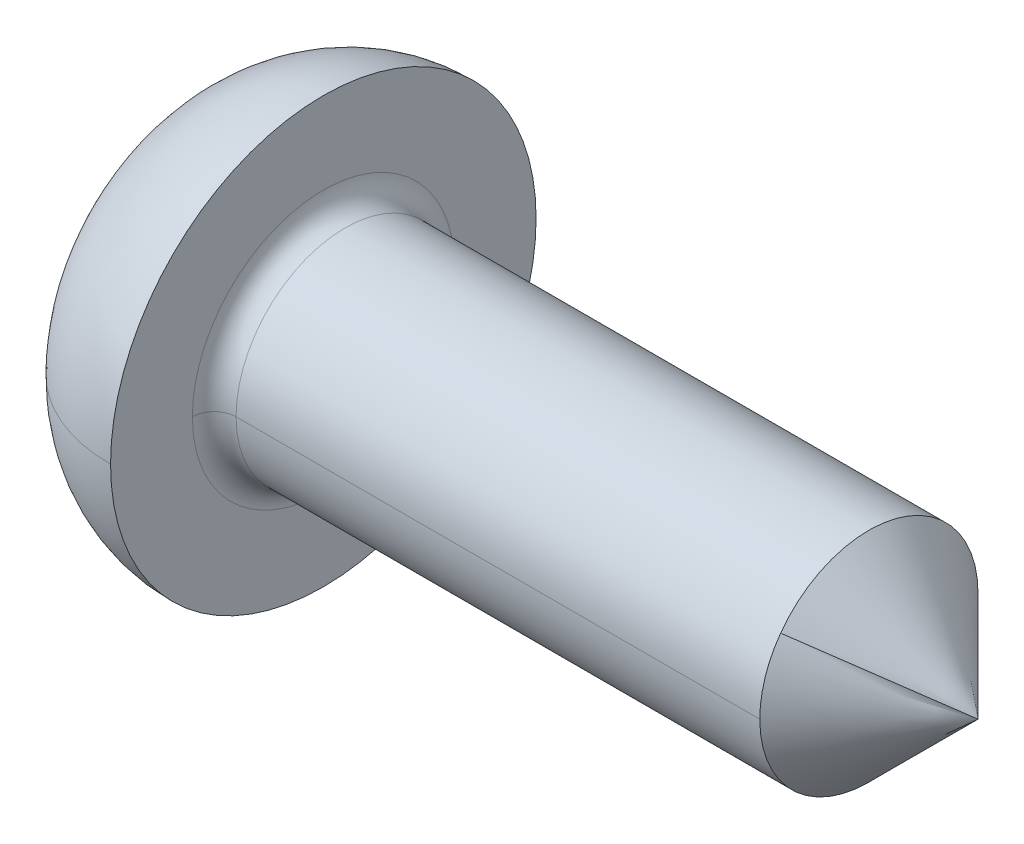
ISO-10303-21;
HEADER;
FILE_DESCRIPTION(('STEP AP214'),'2;1');
FILE_NAME('part.step','',(''),(''),'','','');
FILE_SCHEMA(('AUTOMOTIVE_DESIGN { 1 0 10303 214 1 1 1 1 }'));
ENDSEC;
DATA;
#1=APPLICATION_CONTEXT('core data for automotive mechanical design processes');
#2=APPLICATION_PROTOCOL_DEFINITION('international standard','automotive_design',2000,#1);
#3=PRODUCT_CONTEXT('',#1,'mechanical');
#4=PRODUCT('Part','Part','',(#3));
#5=PRODUCT_RELATED_PRODUCT_CATEGORY('part','',(#4));
#6=PRODUCT_DEFINITION_FORMATION('','',#4);
#7=PRODUCT_DEFINITION_CONTEXT('part definition',#1,'design');
#8=PRODUCT_DEFINITION('design','',#6,#7);
#9=PRODUCT_DEFINITION_SHAPE('','',#8);
#10=(LENGTH_UNIT() NAMED_UNIT(*) SI_UNIT(.MILLI.,.METRE.));
#11=(NAMED_UNIT(*) PLANE_ANGLE_UNIT() SI_UNIT($,.RADIAN.));
#12=(NAMED_UNIT(*) SI_UNIT($,.STERADIAN.) SOLID_ANGLE_UNIT());
#13=UNCERTAINTY_MEASURE_WITH_UNIT(LENGTH_MEASURE(1.E-05),#10,'distance_accuracy_value','');
#14=(GEOMETRIC_REPRESENTATION_CONTEXT(3) GLOBAL_UNCERTAINTY_ASSIGNED_CONTEXT((#13)) GLOBAL_UNIT_ASSIGNED_CONTEXT((#10,
#11,#12)) REPRESENTATION_CONTEXT('',''));
#15=CARTESIAN_POINT('',(0.,0.,0.));
#16=DIRECTION('',(0.,0.,1.));
#17=DIRECTION('',(1.,0.,0.));
#18=AXIS2_PLACEMENT_3D('',#15,#16,#17);
#19=CARTESIAN_POINT('',(7.6,0.,0.));
#20=DIRECTION('',(-1.,0.,0.));
#21=DIRECTION('',(0.,0.,1.));
#22=AXIS2_PLACEMENT_3D('',#19,#20,#21);
#23=CONICAL_SURFACE('',#22,0.,0.785398163397449);
#24=DIRECTION('',(-0.707106781186546,0.415626937777454,0.572061402817686));
#25=VECTOR('',#24,1.);
#26=CARTESIAN_POINT('',(7.1,0.293892626146238,0.404508497187476));
#27=LINE('',#26,#25);
#28=CARTESIAN_POINT('',(7.6,0.,0.));
#29=VERTEX_POINT('',#28);
#30=CARTESIAN_POINT('',(6.6,0.587785252292476,0.809016994374952));
#31=VERTEX_POINT('',#30);
#32=EDGE_CURVE('E151',#29,#31,#27,.T.);
#33=ORIENTED_EDGE('',*,*,#32,.F.);
#34=DIRECTION('',(-0.707106781186542,-0.415626937777458,-0.572061402817687));
#35=VECTOR('',#34,1.);
#36=CARTESIAN_POINT('',(7.1,-0.293892626146242,-0.404508497187479));
#37=LINE('',#36,#35);
#38=CARTESIAN_POINT('',(6.6,-0.587785252292484,-0.809016994374958));
#39=VERTEX_POINT('',#38);
#40=EDGE_CURVE('E20',#29,#39,#37,.T.);
#41=ORIENTED_EDGE('',*,*,#40,.T.);
#42=CARTESIAN_POINT('',(6.59999999999993,0.,0.));
#43=DIRECTION('',(1.,0.,0.));
#44=DIRECTION('',(0.,-0.587785252292462,-0.809016994374955));
#45=AXIS2_PLACEMENT_3D('',#42,#43,#44);
#46=CIRCLE('',#45,0.999999999999987);
#47=CARTESIAN_POINT('',(6.6,0.,-1.));
#48=VERTEX_POINT('',#47);
#49=EDGE_CURVE('E27',#39,#48,#46,.T.);
#50=ORIENTED_EDGE('',*,*,#49,.T.);
#51=CARTESIAN_POINT('',(6.59999999999999,0.,0.));
#52=DIRECTION('',(1.,0.,0.));
#53=DIRECTION('',(0.,0.,-1.));
#54=AXIS2_PLACEMENT_3D('',#51,#52,#53);
#55=CIRCLE('',#54,0.999999999999988);
#56=EDGE_CURVE('E192',#48,#31,#55,.T.);
#57=ORIENTED_EDGE('',*,*,#56,.T.);
#58=EDGE_LOOP('',(#33,#41,#50,#57));
#59=FACE_BOUND('',#58,.T.);
#60=ADVANCED_FACE('F16',(#59),#23,.T.);
#61=CARTESIAN_POINT('',(1.8,0.,0.));
#62=DIRECTION('',(-1.,0.,0.));
#63=DIRECTION('',(0.,0.,1.));
#64=AXIS2_PLACEMENT_3D('',#61,#62,#63);
#65=TOROIDAL_SURFACE('',#64,1.2,0.199999999999999);
#66=CARTESIAN_POINT('',(1.8,0.,1.2));
#67=DIRECTION('',(0.,-1.,0.));
#68=DIRECTION('',(-1.,0.,0.));
#69=AXIS2_PLACEMENT_3D('',#66,#67,#68);
#70=CIRCLE('',#69,0.199999999999998);
#71=CARTESIAN_POINT('',(1.6,0.,1.2));
#72=VERTEX_POINT('',#71);
#73=CARTESIAN_POINT('',(1.8,0.,1.));
#74=VERTEX_POINT('',#73);
#75=EDGE_CURVE('E212',#72,#74,#70,.T.);
#76=ORIENTED_EDGE('',*,*,#75,.F.);
#77=CARTESIAN_POINT('',(1.6,0.,0.));
#78=DIRECTION('',(-1.,0.,0.));
#79=DIRECTION('',(0.,0.,-1.));
#80=AXIS2_PLACEMENT_3D('',#77,#78,#79);
#81=CIRCLE('',#80,1.2);
#82=CARTESIAN_POINT('',(1.6,0.,-1.2));
#83=VERTEX_POINT('',#82);
#84=EDGE_CURVE('E349',#83,#72,#81,.T.);
#85=ORIENTED_EDGE('',*,*,#84,.F.);
#86=CARTESIAN_POINT('',(1.8,0.,-1.2));
#87=DIRECTION('',(0.,1.,0.));
#88=DIRECTION('',(-1.,0.,0.));
#89=AXIS2_PLACEMENT_3D('',#86,#87,#88);
#90=CIRCLE('',#89,0.199999999999999);
#91=CARTESIAN_POINT('',(1.8,0.,-1.));
#92=VERTEX_POINT('',#91);
#93=EDGE_CURVE('E217',#83,#92,#90,.T.);
#94=ORIENTED_EDGE('',*,*,#93,.T.);
#95=CARTESIAN_POINT('',(1.8,0.,0.));
#96=DIRECTION('',(1.,0.,0.));
#97=DIRECTION('',(0.,0.,1.));
#98=AXIS2_PLACEMENT_3D('',#95,#96,#97);
#99=CIRCLE('',#98,1.);
#100=EDGE_CURVE('E352',#74,#92,#99,.T.);
#101=ORIENTED_EDGE('',*,*,#100,.F.);
#102=EDGE_LOOP('',(#76,#85,#94,#101));
#103=FACE_BOUND('',#102,.T.);
#104=ADVANCED_FACE('F361',(#103),#65,.F.);
#105=CARTESIAN_POINT('',(1.58765170566236,0.,0.));
#106=DIRECTION('',(-1.,0.,0.));
#107=DIRECTION('',(0.,0.,1.));
#108=AXIS2_PLACEMENT_3D('',#105,#106,#107);
#109=DEGENERATE_TOROIDAL_SURFACE('',#108,0.55005445811189,1.39999999999999,.T.);
#110=CARTESIAN_POINT('',(1.58765170609632,0.,0.550054456325777));
#111=DIRECTION('',(0.,1.,0.));
#112=DIRECTION('',(-0.791498104640753,0.,0.611171621028084));
#113=AXIS2_PLACEMENT_3D('',#110,#111,#112);
#114=CIRCLE('',#113,1.40000000200565);
#115=CARTESIAN_POINT('',(0.479554358,0.,1.405694727));
#116=VERTEX_POINT('',#115);
#117=CARTESIAN_POINT('',(1.6,0.,1.95));
#118=VERTEX_POINT('',#117);
#119=EDGE_CURVE('E225',#116,#118,#114,.T.);
#120=ORIENTED_EDGE('',*,*,#119,.F.);
#121=CARTESIAN_POINT('',(0.479554358146888,1.67089866280471E-10,-2.20725731945309E-10));
#122=DIRECTION('',(-1.,-1.18868054404933E-10,-1.04494820901307E-10));
#123=DIRECTION('',(1.18868054384562E-10,-1.,1.57004236163373E-10));
#124=AXIS2_PLACEMENT_3D('',#121,#122,#123);
#125=CIRCLE('',#124,1.40569472721441);
#126=CARTESIAN_POINT('',(0.47955435831398,-1.40569472705363,0.));
#127=VERTEX_POINT('',#126);
#128=EDGE_CURVE('E11',#127,#116,#125,.T.);
#129=ORIENTED_EDGE('',*,*,#128,.F.);
#130=CARTESIAN_POINT('',(0.47955435911592,-1.32477119520608E-09,-1.49185405782376E-09));
#131=DIRECTION('',(-1.,4.77289644101491E-10,4.77288722369394E-10));
#132=DIRECTION('',(-4.77288728404106E-10,9.42433439867832E-10,-1.));
#133=AXIS2_PLACEMENT_3D('',#130,#131,#132);
#134=CIRCLE('',#133,1.40569472513012);
#135=CARTESIAN_POINT('',(0.479554358444998,0.,-1.40569472661835));
#136=VERTEX_POINT('',#135);
#137=EDGE_CURVE('E247',#136,#127,#134,.T.);
#138=ORIENTED_EDGE('',*,*,#137,.F.);
#139=CARTESIAN_POINT('',(1.58765170566237,0.,-0.550054458111893));
#140=DIRECTION('',(0.,-1.,0.));
#141=DIRECTION('',(-0.791498105155269,0.,-0.611171620361759));
#142=AXIS2_PLACEMENT_3D('',#139,#140,#141);
#143=CIRCLE('',#142,1.39999999999999);
#144=CARTESIAN_POINT('',(1.59999999999805,0.,-1.94999999977663));
#145=VERTEX_POINT('',#144);
#146=EDGE_CURVE('E233',#136,#145,#143,.T.);
#147=ORIENTED_EDGE('',*,*,#146,.T.);
#148=CARTESIAN_POINT('',(1.59999999999805,-2.23371437941031E-10,0.));
#149=DIRECTION('',(-1.,-9.99245202251857E-13,0.));
#150=DIRECTION('',(0.,1.14549691706295E-10,-1.));
#151=AXIS2_PLACEMENT_3D('',#148,#149,#150);
#152=CIRCLE('',#151,1.94999999978302);
#153=EDGE_CURVE('E346',#145,#118,#152,.T.);
#154=ORIENTED_EDGE('',*,*,#153,.T.);
#155=EDGE_LOOP('',(#120,#129,#138,#147,#154));
#156=FACE_BOUND('',#155,.T.);
#157=ADVANCED_FACE('F379',(#156),#109,.T.);
#158=CARTESIAN_POINT('',(2.30000000000002,0.,0.));
#159=DIRECTION('',(-1.,0.,0.));
#160=DIRECTION('',(0.,-1.,0.));
#161=AXIS2_PLACEMENT_3D('',#158,#159,#160);
#162=SPHERICAL_SURFACE('',#161,2.30000000000002);
#163=CARTESIAN_POINT('',(2.29999998636885,1.03593599627347E-08,0.));
#164=DIRECTION('',(0.,0.,-1.));
#165=DIRECTION('',(-0.884928367598718,0.465727156411421,0.));
#166=AXIS2_PLACEMENT_3D('',#163,#164,#165);
#167=CIRCLE('',#166,2.29999998287399);
#168=CARTESIAN_POINT('',(0.264664756052205,1.07117246212689,0.));
#169=VERTEX_POINT('',#168);
#170=CARTESIAN_POINT('',(0.47955435823357,1.4056947269495,0.));
#171=VERTEX_POINT('',#170);
#172=EDGE_CURVE('E244',#169,#171,#167,.T.);
#173=ORIENTED_EDGE('',*,*,#172,.F.);
#174=CARTESIAN_POINT('',(2.15895189968918,-0.208751319488955,-2.87422299905146E-10));
#175=DIRECTION('',(0.559857422063721,0.828588961403762,0.));
#176=DIRECTION('',(-0.828588961403762,0.559857422063721,1.25710158176161E-10));
#177=AXIS2_PLACEMENT_3D('',#174,#175,#176);
#178=CIRCLE('',#177,2.28616024576008);
#179=CARTESIAN_POINT('',(0.27749446,1.062503743,0.265625936));
#180=VERTEX_POINT('',#179);
#181=EDGE_CURVE('E334',#169,#180,#178,.T.);
#182=ORIENTED_EDGE('',*,*,#181,.T.);
#183=CARTESIAN_POINT('',(2.28751608943151,2.10060709603631E-09,-0.0739047401520381));
#184=DIRECTION('',(0.166559361072882,4.70528438530067E-10,0.98603142913347));
#185=DIRECTION('',(-0.874386852948937,0.462203634353054,0.147700479961587));
#186=AXIS2_PLACEMENT_3D('',#183,#184,#185);
#187=CIRCLE('',#186,2.29877842130487);
#188=CARTESIAN_POINT('',(0.040964512,0.305580319,0.305580319));
#189=VERTEX_POINT('',#188);
#190=EDGE_CURVE('E42',#180,#189,#187,.T.);
#191=ORIENTED_EDGE('',*,*,#190,.T.);
#192=CARTESIAN_POINT('',(2.28751608943132,-0.0739047403057367,2.0925546451861E-09));
#193=DIRECTION('',(0.166559361135809,0.98603142912284,4.50303207074824E-10));
#194=DIRECTION('',(-0.977280609816511,0.16508118215501,0.132931610142105));
#195=AXIS2_PLACEMENT_3D('',#192,#193,#194);
#196=CIRCLE('',#195,2.29877842133112);
#197=CARTESIAN_POINT('',(0.27749446,0.265625936,1.062503743));
#198=VERTEX_POINT('',#197);
#199=EDGE_CURVE('E341',#189,#198,#196,.T.);
#200=ORIENTED_EDGE('',*,*,#199,.T.);
#201=CARTESIAN_POINT('',(2.15895188317715,0.,-0.208751269382771));
#202=DIRECTION('',(0.559857410287015,0.,0.828588969360996));
#203=DIRECTION('',(-0.822977068561767,0.116188679823596,0.556065585432447));
#204=AXIS2_PLACEMENT_3D('',#201,#202,#203);
#205=CIRCLE('',#204,2.28616020427492);
#206=CARTESIAN_POINT('',(0.27749446,-0.265625936,1.062503743));
#207=VERTEX_POINT('',#206);
#208=EDGE_CURVE('E290',#198,#207,#205,.T.);
#209=ORIENTED_EDGE('',*,*,#208,.T.);
#210=CARTESIAN_POINT('',(2.28751608938093,0.0739047402972896,2.10874766541809E-09));
#211=DIRECTION('',(0.166559361135836,-0.986031429122836,4.50294748047722E-10));
#212=DIRECTION('',(-0.874386852937027,-0.147700480026478,0.462203634354849));
#213=AXIS2_PLACEMENT_3D('',#210,#211,#212);
#214=CIRCLE('',#213,2.29877842127833);
#215=CARTESIAN_POINT('',(0.040964512,-0.305580319,0.305580319));
#216=VERTEX_POINT('',#215);
#217=EDGE_CURVE('E298',#207,#216,#214,.T.);
#218=ORIENTED_EDGE('',*,*,#217,.T.);
#219=CARTESIAN_POINT('',(2.28751608943135,-2.10065710486151E-09,-0.0739047401520521));
#220=DIRECTION('',(0.166559361072899,-4.70523062321883E-10,0.986031429133467));
#221=DIRECTION('',(-0.977280609827755,-0.132931610140108,0.165081182090052));
#222=AXIS2_PLACEMENT_3D('',#219,#220,#221);
#223=CIRCLE('',#222,2.29877842130471);
#224=CARTESIAN_POINT('',(0.27749446,-1.062503743,0.265625936));
#225=VERTEX_POINT('',#224);
#226=EDGE_CURVE('E306',#216,#225,#223,.T.);
#227=ORIENTED_EDGE('',*,*,#226,.T.);
#228=CARTESIAN_POINT('',(2.15895191462946,0.208751329581617,-3.45604187518419E-09));
#229=DIRECTION('',(0.559857422063085,-0.828588961404192,0.));
#230=DIRECTION('',(-0.822977060806718,-0.556065597228663,0.116188678298128));
#231=AXIS2_PLACEMENT_3D('',#228,#229,#230);
#232=CIRCLE('',#231,2.28616026403591);
#233=CARTESIAN_POINT('',(0.264664755848336,-1.07117246226464,0.));
#234=VERTEX_POINT('',#233);
#235=EDGE_CURVE('E312',#225,#234,#232,.T.);
#236=ORIENTED_EDGE('',*,*,#235,.T.);
#237=CARTESIAN_POINT('',(2.3000000000001,0.,0.));
#238=DIRECTION('',(0.,0.,1.));
#239=DIRECTION('',(-0.88492836702246,-0.465727157506369,0.));
#240=AXIS2_PLACEMENT_3D('',#237,#238,#239);
#241=CIRCLE('',#240,2.30000000000012);
#242=EDGE_CURVE('E251',#234,#127,#241,.T.);
#243=ORIENTED_EDGE('',*,*,#242,.T.);
#244=ORIENTED_EDGE('',*,*,#128,.T.);
#245=CARTESIAN_POINT('',(0.479554358066478,-1.67090083090079E-10,5.04776837227034E-11));
#246=DIRECTION('',(-1.,1.18867977268328E-10,-4.72918544496762E-11));
#247=DIRECTION('',(-4.72918544414832E-11,1.1886655038728E-10,1.));
#248=AXIS2_PLACEMENT_3D('',#245,#246,#247);
#249=CIRCLE('',#248,1.40569472702972);
#250=EDGE_CURVE('E221',#116,#171,#249,.T.);
#251=ORIENTED_EDGE('',*,*,#250,.T.);
#252=EDGE_LOOP('',(#173,#182,#191,#200,#209,#218,#227,#236,#243,#244,#251));
#253=FACE_BOUND('',#252,.T.);
#254=ADVANCED_FACE('F382',(#253),#162,.T.);
#255=CARTESIAN_POINT('',(1.8,0.,0.));
#256=DIRECTION('',(1.,0.,0.));
#257=DIRECTION('',(0.,1.,0.));
#258=AXIS2_PLACEMENT_3D('',#255,#256,#257);
#259=CYLINDRICAL_SURFACE('',#258,1.);
#260=DIRECTION('',(1.,0.,0.));
#261=VECTOR('',#260,1.);
#262=CARTESIAN_POINT('',(4.2,0.,0.999999999999994));
#263=LINE('',#262,#261);
#264=CARTESIAN_POINT('',(6.6,0.,0.999999999999989));
#265=VERTEX_POINT('',#264);
#266=EDGE_CURVE('E182',#74,#265,#263,.T.);
#267=ORIENTED_EDGE('',*,*,#266,.F.);
#268=ORIENTED_EDGE('',*,*,#100,.T.);
#269=DIRECTION('',(1.,0.,0.));
#270=VECTOR('',#269,1.);
#271=CARTESIAN_POINT('',(4.2,0.,-1.));
#272=LINE('',#271,#270);
#273=EDGE_CURVE('E280',#92,#48,#272,.T.);
#274=ORIENTED_EDGE('',*,*,#273,.T.);
#275=ORIENTED_EDGE('',*,*,#49,.F.);
#276=CARTESIAN_POINT('',(6.6,0.,0.));
#277=DIRECTION('',(1.,0.,0.));
#278=DIRECTION('',(0.,0.,1.));
#279=AXIS2_PLACEMENT_3D('',#276,#277,#278);
#280=CIRCLE('',#279,1.);
#281=EDGE_CURVE('E195',#265,#39,#280,.T.);
#282=ORIENTED_EDGE('',*,*,#281,.F.);
#283=EDGE_LOOP('',(#267,#268,#274,#275,#282));
#284=FACE_BOUND('',#283,.T.);
#285=ADVANCED_FACE('F196',(#284),#259,.T.);
#286=CARTESIAN_POINT('',(1.6,-1.96,1.96));
#287=DIRECTION('',(1.,0.,0.));
#288=DIRECTION('',(0.,0.,-1.));
#289=AXIS2_PLACEMENT_3D('',#286,#287,#288);
#290=PLANE('',#289);
#291=CARTESIAN_POINT('',(1.6,0.,0.));
#292=DIRECTION('',(-1.,0.,0.));
#293=DIRECTION('',(0.,0.,1.));
#294=AXIS2_PLACEMENT_3D('',#291,#292,#293);
#295=CIRCLE('',#294,1.2);
#296=EDGE_CURVE('E199',#72,#83,#295,.T.);
#297=ORIENTED_EDGE('',*,*,#296,.T.);
#298=ORIENTED_EDGE('',*,*,#84,.T.);
#299=EDGE_LOOP('',(#297,#298));
#300=FACE_BOUND('',#299,.T.);
#301=CARTESIAN_POINT('',(1.6,0.,0.));
#302=DIRECTION('',(-1.,0.,0.));
#303=DIRECTION('',(0.,0.,1.));
#304=AXIS2_PLACEMENT_3D('',#301,#302,#303);
#305=CIRCLE('',#304,1.95);
#306=EDGE_CURVE('E229',#118,#145,#305,.T.);
#307=ORIENTED_EDGE('',*,*,#306,.F.);
#308=ORIENTED_EDGE('',*,*,#153,.F.);
#309=EDGE_LOOP('',(#307,#308));
#310=FACE_BOUND('',#309,.T.);
#311=ADVANCED_FACE('F366',(#300,#310),#290,.T.);
#312=CARTESIAN_POINT('',(1.85986031429021,-0.0100000000000003,-0.00166559361735916));
#313=DIRECTION('',(-0.166559362968459,0.,-0.986031428813271));
#314=DIRECTION('',(-0.986031428813271,0.,0.166559362968459));
#315=AXIS2_PLACEMENT_3D('',#312,#313,#314);
#316=PLANE('',#315);
#317=DIRECTION('',(-0.820590262592274,0.554452880002982,0.138613220131204));
#318=VECTOR('',#317,1.);
#319=CARTESIAN_POINT('',(1.06374723,0.5312518715,0.132812968));
#320=LINE('',#319,#318);
#321=CARTESIAN_POINT('',(1.85,0.,0.));
#322=VERTEX_POINT('',#321);
#323=EDGE_CURVE('E330',#322,#180,#320,.T.);
#324=ORIENTED_EDGE('',*,*,#323,.F.);
#325=DIRECTION('',(-0.972632329157707,0.164296001590503,0.164296001590503));
#326=VECTOR('',#325,1.);
#327=CARTESIAN_POINT('',(0.945482256,0.1527901595,0.1527901595));
#328=LINE('',#327,#326);
#329=EDGE_CURVE('E337',#322,#189,#328,.T.);
#330=ORIENTED_EDGE('',*,*,#329,.T.);
#331=ORIENTED_EDGE('',*,*,#190,.F.);
#332=EDGE_LOOP('',(#324,#330,#331));
#333=FACE_BOUND('',#332,.T.);
#334=ADVANCED_FACE('F369',(#333),#316,.T.);
#335=CARTESIAN_POINT('',(0.0311041973813366,0.307245912604717,1.072503743));
#336=DIRECTION('',(-0.166559362968457,-0.986031428813271,0.));
#337=DIRECTION('',(0.,0.,-1.));
#338=AXIS2_PLACEMENT_3D('',#335,#336,#337);
#339=PLANE('',#338);
#340=ORIENTED_EDGE('',*,*,#329,.F.);
#341=DIRECTION('',(-0.820590262592274,0.138613220131204,0.554452880002982));
#342=VECTOR('',#341,1.);
#343=CARTESIAN_POINT('',(1.06374723,0.132812968,0.5312518715));
#344=LINE('',#343,#342);
#345=EDGE_CURVE('E283',#322,#198,#344,.T.);
#346=ORIENTED_EDGE('',*,*,#345,.T.);
#347=ORIENTED_EDGE('',*,*,#199,.F.);
#348=EDGE_LOOP('',(#340,#346,#347));
#349=FACE_BOUND('',#348,.T.);
#350=ADVANCED_FACE('F411',(#349),#339,.T.);
#351=CARTESIAN_POINT('',(1.85828589019304,-0.00559857336371011,-0.275625936));
#352=DIRECTION('',(-0.559857410943987,-0.828588968917096,0.));
#353=DIRECTION('',(0.,0.,1.));
#354=AXIS2_PLACEMENT_3D('',#351,#352,#353);
#355=PLANE('',#354);
#356=DIRECTION('',(-0.820590262592274,0.554452880002982,-0.138613220131204));
#357=VECTOR('',#356,1.);
#358=CARTESIAN_POINT('',(1.06374723,0.5312518715,-0.132812968));
#359=LINE('',#358,#357);
#360=CARTESIAN_POINT('',(0.27749446,1.062503743,-0.265625936));
#361=VERTEX_POINT('',#360);
#362=EDGE_CURVE('E326',#322,#361,#359,.T.);
#363=ORIENTED_EDGE('',*,*,#362,.F.);
#364=ORIENTED_EDGE('',*,*,#323,.T.);
#365=ORIENTED_EDGE('',*,*,#181,.F.);
#366=CARTESIAN_POINT('',(2.15895189151815,-0.208751313967342,-2.8743547317953E-10));
#367=DIRECTION('',(0.559857422063526,0.828588961403893,0.));
#368=DIRECTION('',(-0.822977060826525,0.55606559724269,-0.116188678090702));
#369=AXIS2_PLACEMENT_3D('',#366,#367,#368);
#370=CIRCLE('',#369,2.28616023589835);
#371=EDGE_CURVE('E241',#361,#169,#370,.T.);
#372=ORIENTED_EDGE('',*,*,#371,.F.);
#373=EDGE_LOOP('',(#363,#364,#365,#372));
#374=FACE_BOUND('',#373,.T.);
#375=ADVANCED_FACE('F415',(#374),#355,.T.);
#376=CARTESIAN_POINT('',(0.0311041973813441,-0.01,-0.307245912604716));
#377=DIRECTION('',(-0.166559362968458,0.,0.986031428813271));
#378=DIRECTION('',(0.986031428813271,0.,0.166559362968458));
#379=AXIS2_PLACEMENT_3D('',#376,#377,#378);
#380=PLANE('',#379);
#381=DIRECTION('',(-0.972632329157707,0.164296001590503,-0.164296001590503));
#382=VECTOR('',#381,1.);
#383=CARTESIAN_POINT('',(0.945482256,0.1527901595,-0.1527901595));
#384=LINE('',#383,#382);
#385=CARTESIAN_POINT('',(0.040964512,0.305580319,-0.305580319));
#386=VERTEX_POINT('',#385);
#387=EDGE_CURVE('E323',#322,#386,#384,.T.);
#388=ORIENTED_EDGE('',*,*,#387,.F.);
#389=ORIENTED_EDGE('',*,*,#362,.T.);
#390=CARTESIAN_POINT('',(2.28751608938099,2.10063368609459E-09,0.0739047404506052));
#391=DIRECTION('',(0.166559361198589,4.30125699277138E-10,-0.986031429112236));
#392=DIRECTION('',(-0.977280609805817,0.132931610140114,-0.165081182219922));
#393=AXIS2_PLACEMENT_3D('',#390,#391,#392);
#394=CIRCLE('',#393,2.29877842130478);
#395=EDGE_CURVE('E193',#386,#361,#394,.T.);
#396=ORIENTED_EDGE('',*,*,#395,.F.);
#397=EDGE_LOOP('',(#388,#389,#396));
#398=FACE_BOUND('',#397,.T.);
#399=ADVANCED_FACE('F419',(#398),#380,.T.);
#400=CARTESIAN_POINT('',(0.031104197361184,0.307245912608121,0.01));
#401=DIRECTION('',(-0.166559362968457,-0.986031428813271,0.));
#402=DIRECTION('',(0.,0.,-1.));
#403=AXIS2_PLACEMENT_3D('',#400,#401,#402);
#404=PLANE('',#403);
#405=DIRECTION('',(-0.820590262592274,0.138613220131204,-0.554452880002982));
#406=VECTOR('',#405,1.);
#407=CARTESIAN_POINT('',(1.06374723,0.132812968,-0.5312518715));
#408=LINE('',#407,#406);
#409=CARTESIAN_POINT('',(0.27749446,0.265625936,-1.062503743));
#410=VERTEX_POINT('',#409);
#411=EDGE_CURVE('E320',#322,#410,#408,.T.);
#412=ORIENTED_EDGE('',*,*,#411,.F.);
#413=ORIENTED_EDGE('',*,*,#387,.T.);
#414=CARTESIAN_POINT('',(2.28751608943162,-0.0739047403056605,-2.09246568639784E-09));
#415=DIRECTION('',(0.166559361135758,0.986031429122849,-4.50319900631437E-10));
#416=DIRECTION('',(-0.874386852938885,0.147700480026709,-0.462203634351259));
#417=AXIS2_PLACEMENT_3D('',#414,#415,#416);
#418=CIRCLE('',#417,2.29877842133141);
#419=EDGE_CURVE('E271',#410,#386,#418,.T.);
#420=ORIENTED_EDGE('',*,*,#419,.F.);
#421=EDGE_LOOP('',(#412,#413,#420));
#422=FACE_BOUND('',#421,.T.);
#423=ADVANCED_FACE('F423',(#422),#404,.T.);
#424=CARTESIAN_POINT('',(0.243461675892544,-0.275625936,-1.08549886778312));
#425=DIRECTION('',(-0.559857410943987,0.,0.828588968917096));
#426=DIRECTION('',(0.828588968917096,0.,0.559857410943987));
#427=AXIS2_PLACEMENT_3D('',#424,#425,#426);
#428=PLANE('',#427);
#429=DIRECTION('',(-0.820590262592274,-0.138613220131204,-0.554452880002982));
#430=VECTOR('',#429,1.);
#431=CARTESIAN_POINT('',(1.06374723,-0.132812968,-0.5312518715));
#432=LINE('',#431,#430);
#433=CARTESIAN_POINT('',(0.27749446,-0.265625936,-1.062503743));
#434=VERTEX_POINT('',#433);
#435=EDGE_CURVE('E317',#322,#434,#432,.T.);
#436=ORIENTED_EDGE('',*,*,#435,.F.);
#437=ORIENTED_EDGE('',*,*,#411,.T.);
#438=CARTESIAN_POINT('',(2.15895186382571,0.,0.208751298411282));
#439=DIRECTION('',(0.559857423017486,0.,-0.828588960759326));
#440=DIRECTION('',(-0.822977060019419,-0.11618867981262,-0.556065598077416));
#441=AXIS2_PLACEMENT_3D('',#438,#439,#440);
#442=CIRCLE('',#441,2.28616020449088);
#443=EDGE_CURVE('E267',#434,#410,#442,.T.);
#444=ORIENTED_EDGE('',*,*,#443,.F.);
#445=EDGE_LOOP('',(#436,#437,#444));
#446=FACE_BOUND('',#445,.T.);
#447=ADVANCED_FACE('F427',(#446),#428,.T.);
#448=CARTESIAN_POINT('',(0.0311041973813439,-0.307245912604716,-1.072503743));
#449=DIRECTION('',(-0.166559362968458,0.986031428813271,0.));
#450=DIRECTION('',(0.,0.,1.));
#451=AXIS2_PLACEMENT_3D('',#448,#449,#450);
#452=PLANE('',#451);
#453=DIRECTION('',(-0.972632329157707,-0.164296001590503,-0.164296001590503));
#454=VECTOR('',#453,1.);
#455=CARTESIAN_POINT('',(0.945482256,-0.1527901595,-0.1527901595));
#456=LINE('',#455,#454);
#457=CARTESIAN_POINT('',(0.040964512,-0.305580319,-0.305580319));
#458=VERTEX_POINT('',#457);
#459=EDGE_CURVE('E110',#322,#458,#456,.T.);
#460=ORIENTED_EDGE('',*,*,#459,.F.);
#461=ORIENTED_EDGE('',*,*,#435,.T.);
#462=CARTESIAN_POINT('',(2.28751608938084,0.0739047402970864,-2.10878797063385E-09));
#463=DIRECTION('',(0.166559361135759,-0.986031429122849,-4.50319410514034E-10));
#464=DIRECTION('',(-0.977280609817049,-0.165081182155048,-0.132931610138103));
#465=AXIS2_PLACEMENT_3D('',#462,#463,#464);
#466=CIRCLE('',#465,2.2987784212782);
#467=EDGE_CURVE('E263',#458,#434,#466,.T.);
#468=ORIENTED_EDGE('',*,*,#467,.F.);
#469=EDGE_LOOP('',(#460,#461,#468));
#470=FACE_BOUND('',#469,.T.);
#471=ADVANCED_FACE('F431',(#470),#452,.T.);
#472=CARTESIAN_POINT('',(0.031104197359628,-1.072503743,-0.307245912608384));
#473=DIRECTION('',(-0.166559362968458,0.,0.986031428813271));
#474=DIRECTION('',(0.986031428813271,0.,0.166559362968458));
#475=AXIS2_PLACEMENT_3D('',#472,#473,#474);
#476=PLANE('',#475);
#477=DIRECTION('',(-0.820590262592274,-0.554452880002982,-0.138613220131204));
#478=VECTOR('',#477,1.);
#479=CARTESIAN_POINT('',(1.06374723,-0.5312518715,-0.132812968));
#480=LINE('',#479,#478);
#481=CARTESIAN_POINT('',(0.27749446,-1.062503743,-0.265625936));
#482=VERTEX_POINT('',#481);
#483=EDGE_CURVE('E123',#322,#482,#480,.T.);
#484=ORIENTED_EDGE('',*,*,#483,.F.);
#485=ORIENTED_EDGE('',*,*,#459,.T.);
#486=CARTESIAN_POINT('',(2.28751608938082,-2.10068879067001E-09,0.0739047404505736));
#487=DIRECTION('',(0.166559361198587,-4.30126062180507E-10,-0.986031429112236));
#488=DIRECTION('',(-0.874386852926987,-0.462203634353072,-0.147700480091471));
#489=AXIS2_PLACEMENT_3D('',#486,#487,#488);
#490=CIRCLE('',#489,2.2987784213046);
#491=EDGE_CURVE('E259',#482,#458,#490,.T.);
#492=ORIENTED_EDGE('',*,*,#491,.F.);
#493=EDGE_LOOP('',(#484,#485,#492));
#494=FACE_BOUND('',#493,.T.);
#495=ADVANCED_FACE('F435',(#494),#476,.T.);
#496=CARTESIAN_POINT('',(0.256378866380135,-1.07677103638017,-0.275625936));
#497=DIRECTION('',(-0.559857410943987,0.828588968917096,0.));
#498=DIRECTION('',(0.,0.,1.));
#499=AXIS2_PLACEMENT_3D('',#496,#497,#498);
#500=PLANE('',#499);
#501=DIRECTION('',(-0.820590262592274,-0.554452880002982,0.138613220131204));
#502=VECTOR('',#501,1.);
#503=CARTESIAN_POINT('',(1.06374723,-0.5312518715,0.132812968));
#504=LINE('',#503,#502);
#505=EDGE_CURVE('E302',#322,#225,#504,.T.);
#506=ORIENTED_EDGE('',*,*,#505,.F.);
#507=ORIENTED_EDGE('',*,*,#483,.T.);
#508=CARTESIAN_POINT('',(2.15895190931889,0.208751325994685,3.08248204614412E-09));
#509=DIRECTION('',(0.559857422063473,-0.828588961403929,0.));
#510=DIRECTION('',(-0.82858896140393,-0.559857422063473,-1.34833537692522E-09));
#511=AXIS2_PLACEMENT_3D('',#508,#509,#510);
#512=CIRCLE('',#511,2.28616025762747);
#513=EDGE_CURVE('E255',#234,#482,#512,.T.);
#514=ORIENTED_EDGE('',*,*,#513,.F.);
#515=ORIENTED_EDGE('',*,*,#235,.F.);
#516=EDGE_LOOP('',(#506,#507,#514,#515));
#517=FACE_BOUND('',#516,.T.);
#518=ADVANCED_FACE('F439',(#517),#500,.T.);
#519=CARTESIAN_POINT('',(1.85986031429021,-1.072503743,-0.00166559361735916));
#520=DIRECTION('',(-0.166559362968458,0.,-0.986031428813271));
#521=DIRECTION('',(-0.986031428813271,0.,0.166559362968458));
#522=AXIS2_PLACEMENT_3D('',#519,#520,#521);
#523=PLANE('',#522);
#524=DIRECTION('',(-0.972632329157707,-0.164296001590503,0.164296001590503));
#525=VECTOR('',#524,1.);
#526=CARTESIAN_POINT('',(0.945482256,-0.1527901595,0.1527901595));
#527=LINE('',#526,#525);
#528=EDGE_CURVE('E294',#322,#216,#527,.T.);
#529=ORIENTED_EDGE('',*,*,#528,.F.);
#530=ORIENTED_EDGE('',*,*,#505,.T.);
#531=ORIENTED_EDGE('',*,*,#226,.F.);
#532=EDGE_LOOP('',(#529,#530,#531));
#533=FACE_BOUND('',#532,.T.);
#534=ADVANCED_FACE('F442',(#533),#523,.T.);
#535=CARTESIAN_POINT('',(0.0311041973580871,-0.307245912608644,-0.01));
#536=DIRECTION('',(-0.166559362968457,0.986031428813271,0.));
#537=DIRECTION('',(0.,0.,1.));
#538=AXIS2_PLACEMENT_3D('',#535,#536,#537);
#539=PLANE('',#538);
#540=DIRECTION('',(-0.820590262592274,-0.138613220131204,0.554452880002982));
#541=VECTOR('',#540,1.);
#542=CARTESIAN_POINT('',(1.06374723,-0.132812968,0.5312518715));
#543=LINE('',#542,#541);
#544=EDGE_CURVE('E287',#322,#207,#543,.T.);
#545=ORIENTED_EDGE('',*,*,#544,.F.);
#546=ORIENTED_EDGE('',*,*,#528,.T.);
#547=ORIENTED_EDGE('',*,*,#217,.F.);
#548=EDGE_LOOP('',(#545,#546,#547));
#549=FACE_BOUND('',#548,.T.);
#550=ADVANCED_FACE('F445',(#549),#539,.T.);
#551=CARTESIAN_POINT('',(1.85828589019304,-0.275625936,-0.00559857336370984));
#552=DIRECTION('',(-0.559857410943985,0.,-0.828588968917097));
#553=DIRECTION('',(-0.828588968917097,0.,0.559857410943985));
#554=AXIS2_PLACEMENT_3D('',#551,#552,#553);
#555=PLANE('',#554);
#556=ORIENTED_EDGE('',*,*,#345,.F.);
#557=ORIENTED_EDGE('',*,*,#544,.T.);
#558=ORIENTED_EDGE('',*,*,#208,.F.);
#559=EDGE_LOOP('',(#556,#557,#558));
#560=FACE_BOUND('',#559,.T.);
#561=ADVANCED_FACE('F394',(#560),#555,.T.);
#562=CARTESIAN_POINT('',(1.8,0.,0.));
#563=DIRECTION('',(1.,0.,0.));
#564=DIRECTION('',(0.,0.,-1.));
#565=AXIS2_PLACEMENT_3D('',#562,#563,#564);
#566=CYLINDRICAL_SURFACE('',#565,1.);
#567=CARTESIAN_POINT('',(1.8,0.,0.));
#568=DIRECTION('',(1.,0.,0.));
#569=DIRECTION('',(0.,0.,-1.));
#570=AXIS2_PLACEMENT_3D('',#567,#568,#569);
#571=CIRCLE('',#570,1.);
#572=EDGE_CURVE('E189',#92,#74,#571,.T.);
#573=ORIENTED_EDGE('',*,*,#572,.T.);
#574=ORIENTED_EDGE('',*,*,#266,.T.);
#575=CARTESIAN_POINT('',(6.59999999999972,0.,-2.80374681804751E-13));
#576=DIRECTION('',(1.,-1.17262388506223E-13,-2.54566322290204E-13));
#577=DIRECTION('',(2.74953670942246E-13,0.587785252292397,0.809016994375003));
#578=AXIS2_PLACEMENT_3D('',#575,#576,#577);
#579=CIRCLE('',#578,1.00000000000028);
#580=EDGE_CURVE('E186',#31,#265,#579,.T.);
#581=ORIENTED_EDGE('',*,*,#580,.F.);
#582=ORIENTED_EDGE('',*,*,#56,.F.);
#583=ORIENTED_EDGE('',*,*,#273,.F.);
#584=EDGE_LOOP('',(#573,#574,#581,#582,#583));
#585=FACE_BOUND('',#584,.T.);
#586=ADVANCED_FACE('F183',(#585),#566,.T.);
#587=CARTESIAN_POINT('',(2.30000000000002,0.,0.));
#588=DIRECTION('',(-1.,0.,0.));
#589=DIRECTION('',(0.,1.,0.));
#590=AXIS2_PLACEMENT_3D('',#587,#588,#589);
#591=SPHERICAL_SURFACE('',#590,2.30000000000002);
#592=ORIENTED_EDGE('',*,*,#371,.T.);
#593=ORIENTED_EDGE('',*,*,#172,.T.);
#594=CARTESIAN_POINT('',(0.479554358511476,5.48742650790051E-10,-5.052919274521E-11));
#595=DIRECTION('',(-1.,-1.97700036774729E-10,4.72918544270615E-11));
#596=DIRECTION('',(-1.97700036877469E-10,1.,3.59277777582495E-11));
#597=AXIS2_PLACEMENT_3D('',#594,#595,#596);
#598=CIRCLE('',#597,1.40569472650142);
#599=EDGE_CURVE('E237',#171,#136,#598,.T.);
#600=ORIENTED_EDGE('',*,*,#599,.T.);
#601=ORIENTED_EDGE('',*,*,#137,.T.);
#602=ORIENTED_EDGE('',*,*,#242,.F.);
#603=ORIENTED_EDGE('',*,*,#513,.T.);
#604=ORIENTED_EDGE('',*,*,#491,.T.);
#605=ORIENTED_EDGE('',*,*,#467,.T.);
#606=ORIENTED_EDGE('',*,*,#443,.T.);
#607=ORIENTED_EDGE('',*,*,#419,.T.);
#608=ORIENTED_EDGE('',*,*,#395,.T.);
#609=EDGE_LOOP('',(#592,#593,#600,#601,#602,#603,#604,#605,#606,#607,#608));
#610=FACE_BOUND('',#609,.T.);
#611=ADVANCED_FACE('F384',(#610),#591,.T.);
#612=CARTESIAN_POINT('',(1.58765170566237,0.,0.));
#613=DIRECTION('',(-1.,0.,0.));
#614=DIRECTION('',(0.,0.,1.));
#615=AXIS2_PLACEMENT_3D('',#612,#613,#614);
#616=DEGENERATE_TOROIDAL_SURFACE('',#615,0.550054458111888,1.4,.T.);
#617=ORIENTED_EDGE('',*,*,#250,.F.);
#618=ORIENTED_EDGE('',*,*,#119,.T.);
#619=ORIENTED_EDGE('',*,*,#306,.T.);
#620=ORIENTED_EDGE('',*,*,#146,.F.);
#621=ORIENTED_EDGE('',*,*,#599,.F.);
#622=EDGE_LOOP('',(#617,#618,#619,#620,#621));
#623=FACE_BOUND('',#622,.T.);
#624=ADVANCED_FACE('F376',(#623),#616,.T.);
#625=CARTESIAN_POINT('',(1.8,0.,0.));
#626=DIRECTION('',(-1.,0.,0.));
#627=DIRECTION('',(0.,-1.,0.));
#628=AXIS2_PLACEMENT_3D('',#625,#626,#627);
#629=TOROIDAL_SURFACE('',#628,1.2,0.199999999999998);
#630=ORIENTED_EDGE('',*,*,#296,.F.);
#631=ORIENTED_EDGE('',*,*,#75,.T.);
#632=ORIENTED_EDGE('',*,*,#572,.F.);
#633=ORIENTED_EDGE('',*,*,#93,.F.);
#634=EDGE_LOOP('',(#630,#631,#632,#633));
#635=FACE_BOUND('',#634,.T.);
#636=ADVANCED_FACE('F364',(#635),#629,.F.);
#637=CARTESIAN_POINT('',(7.6,0.,0.));
#638=DIRECTION('',(-1.,0.,0.));
#639=DIRECTION('',(0.,0.,1.));
#640=AXIS2_PLACEMENT_3D('',#637,#638,#639);
#641=CONICAL_SURFACE('',#640,0.,0.785398163397449);
#642=ORIENTED_EDGE('',*,*,#40,.F.);
#643=ORIENTED_EDGE('',*,*,#32,.T.);
#644=ORIENTED_EDGE('',*,*,#580,.T.);
#645=ORIENTED_EDGE('',*,*,#281,.T.);
#646=EDGE_LOOP('',(#642,#643,#644,#645));
#647=FACE_BOUND('',#646,.T.);
#648=ADVANCED_FACE('F18',(#647),#641,.T.);
#649=CLOSED_SHELL('',(#60,#104,#157,#254,#285,#311,#334,#350,#375,#399,#423,#447,#471,#495,#518,
#534,#550,#561,#586,#611,#624,#636,#648));
#650=MANIFOLD_SOLID_BREP('B1',#649);
#651=ADVANCED_BREP_SHAPE_REPRESENTATION('',(#18,#650),#14);
#652=SHAPE_DEFINITION_REPRESENTATION(#9,#651);
ENDSEC;
END-ISO-10303-21;
